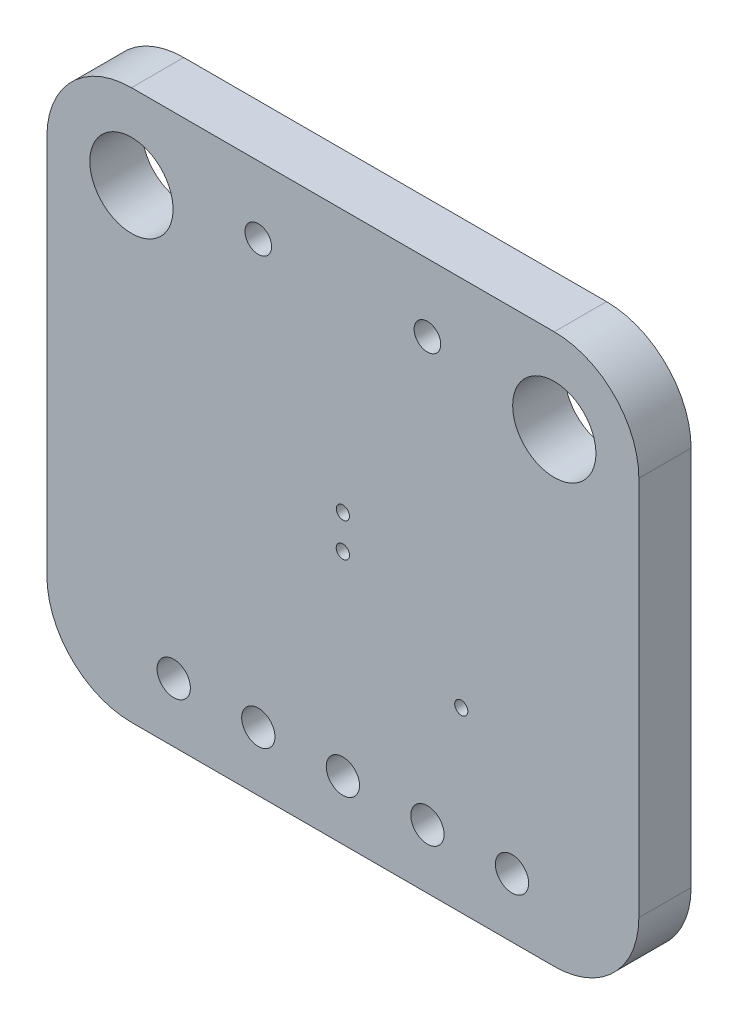
ISO-10303-21;
HEADER;
FILE_DESCRIPTION(('STEP AP214'),'2;1');
FILE_NAME('part.step','',(''),(''),'','','');
FILE_SCHEMA(('AUTOMOTIVE_DESIGN { 1 0 10303 214 1 1 1 1 }'));
ENDSEC;
DATA;
#1=APPLICATION_CONTEXT('core data for automotive mechanical design processes');
#2=APPLICATION_PROTOCOL_DEFINITION('international standard','automotive_design',2000,#1);
#3=PRODUCT_CONTEXT('',#1,'mechanical');
#4=PRODUCT('Part','Part','',(#3));
#5=PRODUCT_RELATED_PRODUCT_CATEGORY('part','',(#4));
#6=PRODUCT_DEFINITION_FORMATION('','',#4);
#7=PRODUCT_DEFINITION_CONTEXT('part definition',#1,'design');
#8=PRODUCT_DEFINITION('design','',#6,#7);
#9=PRODUCT_DEFINITION_SHAPE('','',#8);
#10=(LENGTH_UNIT() NAMED_UNIT(*) SI_UNIT(.MILLI.,.METRE.));
#11=(NAMED_UNIT(*) PLANE_ANGLE_UNIT() SI_UNIT($,.RADIAN.));
#12=(NAMED_UNIT(*) SI_UNIT($,.STERADIAN.) SOLID_ANGLE_UNIT());
#13=UNCERTAINTY_MEASURE_WITH_UNIT(LENGTH_MEASURE(1.E-05),#10,'distance_accuracy_value','');
#14=(GEOMETRIC_REPRESENTATION_CONTEXT(3) GLOBAL_UNCERTAINTY_ASSIGNED_CONTEXT((#13)) GLOBAL_UNIT_ASSIGNED_CONTEXT((#10,
#11,#12)) REPRESENTATION_CONTEXT('',''));
#15=CARTESIAN_POINT('',(0.,0.,0.));
#16=DIRECTION('',(0.,0.,1.));
#17=DIRECTION('',(1.,0.,0.));
#18=AXIS2_PLACEMENT_3D('',#15,#16,#17);
#19=CARTESIAN_POINT('',(8.89,8.255,0.));
#20=DIRECTION('',(0.,0.,1.));
#21=DIRECTION('',(1.,0.,0.));
#22=AXIS2_PLACEMENT_3D('',#19,#20,#21);
#23=PLANE('',#22);
#24=CARTESIAN_POINT('',(13.97,1.778,0.));
#25=DIRECTION('',(0.,0.,1.));
#26=DIRECTION('',(1.,0.,0.));
#27=AXIS2_PLACEMENT_3D('',#24,#25,#26);
#28=CIRCLE('',#27,0.5);
#29=CARTESIAN_POINT('',(13.47,1.778,0.));
#30=VERTEX_POINT('',#29);
#31=EDGE_CURVE('E308',#30,#30,#28,.T.);
#32=ORIENTED_EDGE('',*,*,#31,.T.);
#33=EDGE_LOOP('',(#32));
#34=FACE_BOUND('',#33,.T.);
#35=CARTESIAN_POINT('',(8.89,1.778,0.));
#36=DIRECTION('',(0.,0.,1.));
#37=DIRECTION('',(1.,0.,0.));
#38=AXIS2_PLACEMENT_3D('',#35,#36,#37);
#39=CIRCLE('',#38,0.5);
#40=CARTESIAN_POINT('',(8.39,1.778,0.));
#41=VERTEX_POINT('',#40);
#42=EDGE_CURVE('E262',#41,#41,#39,.T.);
#43=ORIENTED_EDGE('',*,*,#42,.T.);
#44=EDGE_LOOP('',(#43));
#45=FACE_BOUND('',#44,.T.);
#46=CARTESIAN_POINT('',(3.81,1.778,0.));
#47=DIRECTION('',(0.,0.,1.));
#48=DIRECTION('',(1.,0.,0.));
#49=AXIS2_PLACEMENT_3D('',#46,#47,#48);
#50=CIRCLE('',#49,0.5);
#51=CARTESIAN_POINT('',(3.31,1.778,0.));
#52=VERTEX_POINT('',#51);
#53=EDGE_CURVE('E346',#52,#52,#50,.T.);
#54=ORIENTED_EDGE('',*,*,#53,.T.);
#55=EDGE_LOOP('',(#54));
#56=FACE_BOUND('',#55,.T.);
#57=CARTESIAN_POINT('',(11.43,14.478,0.));
#58=DIRECTION('',(0.,0.,1.));
#59=DIRECTION('',(1.,0.,0.));
#60=AXIS2_PLACEMENT_3D('',#57,#58,#59);
#61=CIRCLE('',#60,0.4);
#62=CARTESIAN_POINT('',(11.03,14.478,0.));
#63=VERTEX_POINT('',#62);
#64=EDGE_CURVE('E298',#63,#63,#61,.T.);
#65=ORIENTED_EDGE('',*,*,#64,.T.);
#66=EDGE_LOOP('',(#65));
#67=FACE_BOUND('',#66,.T.);
#68=CARTESIAN_POINT('',(8.89,7.62,0.));
#69=DIRECTION('',(0.,0.,1.));
#70=DIRECTION('',(1.,0.,0.));
#71=AXIS2_PLACEMENT_3D('',#68,#69,#70);
#72=CIRCLE('',#71,0.2);
#73=CARTESIAN_POINT('',(8.69,7.62,0.));
#74=VERTEX_POINT('',#73);
#75=EDGE_CURVE('E316',#74,#74,#72,.T.);
#76=ORIENTED_EDGE('',*,*,#75,.T.);
#77=EDGE_LOOP('',(#76));
#78=FACE_BOUND('',#77,.T.);
#79=CARTESIAN_POINT('',(12.446,5.334,0.));
#80=DIRECTION('',(0.,0.,1.));
#81=DIRECTION('',(1.,0.,0.));
#82=AXIS2_PLACEMENT_3D('',#79,#80,#81);
#83=CIRCLE('',#82,0.197);
#84=CARTESIAN_POINT('',(12.249,5.334,0.));
#85=VERTEX_POINT('',#84);
#86=EDGE_CURVE('E290',#85,#85,#83,.T.);
#87=ORIENTED_EDGE('',*,*,#86,.T.);
#88=EDGE_LOOP('',(#87));
#89=FACE_BOUND('',#88,.T.);
#90=CARTESIAN_POINT('',(6.35,14.478,0.));
#91=DIRECTION('',(0.,0.,1.));
#92=DIRECTION('',(1.,0.,0.));
#93=AXIS2_PLACEMENT_3D('',#90,#91,#92);
#94=CIRCLE('',#93,0.4);
#95=CARTESIAN_POINT('',(5.95,14.478,0.));
#96=VERTEX_POINT('',#95);
#97=EDGE_CURVE('E279',#96,#96,#94,.T.);
#98=ORIENTED_EDGE('',*,*,#97,.T.);
#99=EDGE_LOOP('',(#98));
#100=FACE_BOUND('',#99,.T.);
#101=CARTESIAN_POINT('',(8.89,8.636,0.));
#102=DIRECTION('',(0.,0.,1.));
#103=DIRECTION('',(1.,0.,0.));
#104=AXIS2_PLACEMENT_3D('',#101,#102,#103);
#105=CIRCLE('',#104,0.197);
#106=CARTESIAN_POINT('',(8.693,8.636,0.));
#107=VERTEX_POINT('',#106);
#108=EDGE_CURVE('E268',#107,#107,#105,.T.);
#109=ORIENTED_EDGE('',*,*,#108,.T.);
#110=EDGE_LOOP('',(#109));
#111=FACE_BOUND('',#110,.T.);
#112=CARTESIAN_POINT('',(2.54,13.97,0.));
#113=DIRECTION('',(0.,0.,1.));
#114=DIRECTION('',(1.,0.,0.));
#115=AXIS2_PLACEMENT_3D('',#112,#113,#114);
#116=CIRCLE('',#115,1.25);
#117=CARTESIAN_POINT('',(1.29,13.97,0.));
#118=VERTEX_POINT('',#117);
#119=EDGE_CURVE('E256',#118,#118,#116,.T.);
#120=ORIENTED_EDGE('',*,*,#119,.T.);
#121=EDGE_LOOP('',(#120));
#122=FACE_BOUND('',#121,.T.);
#123=CARTESIAN_POINT('',(15.24,13.97,0.));
#124=DIRECTION('',(0.,0.,1.));
#125=DIRECTION('',(1.,0.,0.));
#126=AXIS2_PLACEMENT_3D('',#123,#124,#125);
#127=CIRCLE('',#126,1.25);
#128=CARTESIAN_POINT('',(13.99,13.97,0.));
#129=VERTEX_POINT('',#128);
#130=EDGE_CURVE('E231',#129,#129,#127,.T.);
#131=ORIENTED_EDGE('',*,*,#130,.T.);
#132=EDGE_LOOP('',(#131));
#133=FACE_BOUND('',#132,.T.);
#134=CARTESIAN_POINT('',(6.35,1.778,0.));
#135=DIRECTION('',(0.,0.,1.));
#136=DIRECTION('',(1.,0.,0.));
#137=AXIS2_PLACEMENT_3D('',#134,#135,#136);
#138=CIRCLE('',#137,0.5);
#139=CARTESIAN_POINT('',(5.85,1.778,0.));
#140=VERTEX_POINT('',#139);
#141=EDGE_CURVE('E222',#140,#140,#138,.T.);
#142=ORIENTED_EDGE('',*,*,#141,.T.);
#143=EDGE_LOOP('',(#142));
#144=FACE_BOUND('',#143,.T.);
#145=CARTESIAN_POINT('',(11.43,1.778,0.));
#146=DIRECTION('',(0.,0.,1.));
#147=DIRECTION('',(1.,0.,0.));
#148=AXIS2_PLACEMENT_3D('',#145,#146,#147);
#149=CIRCLE('',#148,0.5);
#150=CARTESIAN_POINT('',(10.93,1.778,0.));
#151=VERTEX_POINT('',#150);
#152=EDGE_CURVE('E201',#151,#151,#149,.T.);
#153=ORIENTED_EDGE('',*,*,#152,.T.);
#154=EDGE_LOOP('',(#153));
#155=FACE_BOUND('',#154,.T.);
#156=CARTESIAN_POINT('',(2.54,13.97,0.));
#157=DIRECTION('',(0.,0.,1.));
#158=DIRECTION('',(0.,1.,0.));
#159=AXIS2_PLACEMENT_3D('',#156,#157,#158);
#160=CIRCLE('',#159,2.54);
#161=CARTESIAN_POINT('',(2.54,16.51,0.));
#162=VERTEX_POINT('',#161);
#163=CARTESIAN_POINT('',(0.,13.97,0.));
#164=VERTEX_POINT('',#163);
#165=EDGE_CURVE('E25',#162,#164,#160,.T.);
#166=ORIENTED_EDGE('',*,*,#165,.F.);
#167=DIRECTION('',(1.,0.,0.));
#168=VECTOR('',#167,1.);
#169=CARTESIAN_POINT('',(2.54,16.51,0.));
#170=LINE('',#169,#168);
#171=CARTESIAN_POINT('',(15.24,16.51,0.));
#172=VERTEX_POINT('',#171);
#173=EDGE_CURVE('E367',#162,#172,#170,.T.);
#174=ORIENTED_EDGE('',*,*,#173,.T.);
#175=CARTESIAN_POINT('',(15.24,13.97,0.));
#176=DIRECTION('',(0.,0.,1.));
#177=DIRECTION('',(1.,0.,0.));
#178=AXIS2_PLACEMENT_3D('',#175,#176,#177);
#179=CIRCLE('',#178,2.54);
#180=CARTESIAN_POINT('',(17.78,13.97,0.));
#181=VERTEX_POINT('',#180);
#182=EDGE_CURVE('E335',#181,#172,#179,.T.);
#183=ORIENTED_EDGE('',*,*,#182,.F.);
#184=DIRECTION('',(0.,-1.,0.));
#185=VECTOR('',#184,1.);
#186=CARTESIAN_POINT('',(17.78,13.97,0.));
#187=LINE('',#186,#185);
#188=CARTESIAN_POINT('',(17.78,2.54,0.));
#189=VERTEX_POINT('',#188);
#190=EDGE_CURVE('E218',#181,#189,#187,.T.);
#191=ORIENTED_EDGE('',*,*,#190,.T.);
#192=CARTESIAN_POINT('',(15.24,2.54,0.));
#193=DIRECTION('',(0.,0.,1.));
#194=DIRECTION('',(0.,-1.,0.));
#195=AXIS2_PLACEMENT_3D('',#192,#193,#194);
#196=CIRCLE('',#195,2.54);
#197=CARTESIAN_POINT('',(15.24,0.,0.));
#198=VERTEX_POINT('',#197);
#199=EDGE_CURVE('E385',#198,#189,#196,.T.);
#200=ORIENTED_EDGE('',*,*,#199,.F.);
#201=DIRECTION('',(-1.,0.,0.));
#202=VECTOR('',#201,1.);
#203=CARTESIAN_POINT('',(15.24,0.,0.));
#204=LINE('',#203,#202);
#205=CARTESIAN_POINT('',(2.54,0.,0.));
#206=VERTEX_POINT('',#205);
#207=EDGE_CURVE('E317',#198,#206,#204,.T.);
#208=ORIENTED_EDGE('',*,*,#207,.T.);
#209=CARTESIAN_POINT('',(2.54,2.54,0.));
#210=DIRECTION('',(0.,0.,1.));
#211=DIRECTION('',(-1.,0.,0.));
#212=AXIS2_PLACEMENT_3D('',#209,#210,#211);
#213=CIRCLE('',#212,2.54);
#214=CARTESIAN_POINT('',(0.,2.54,0.));
#215=VERTEX_POINT('',#214);
#216=EDGE_CURVE('E248',#215,#206,#213,.T.);
#217=ORIENTED_EDGE('',*,*,#216,.F.);
#218=DIRECTION('',(0.,1.,0.));
#219=VECTOR('',#218,1.);
#220=CARTESIAN_POINT('',(0.,2.54,0.));
#221=LINE('',#220,#219);
#222=EDGE_CURVE('E405',#215,#164,#221,.T.);
#223=ORIENTED_EDGE('',*,*,#222,.T.);
#224=EDGE_LOOP('',(#166,#174,#183,#191,#200,#208,#217,#223));
#225=FACE_BOUND('',#224,.T.);
#226=ADVANCED_FACE('F17',(#34,#45,#56,#67,#78,#89,#100,#111,#122,#133,#144,#155,#225),#23,.F.);
#227=CARTESIAN_POINT('',(8.89,8.255,1.57));
#228=DIRECTION('',(0.,0.,1.));
#229=DIRECTION('',(1.,0.,0.));
#230=AXIS2_PLACEMENT_3D('',#227,#228,#229);
#231=PLANE('',#230);
#232=CARTESIAN_POINT('',(13.97,1.778,1.57));
#233=DIRECTION('',(0.,0.,-1.));
#234=DIRECTION('',(1.,0.,0.));
#235=AXIS2_PLACEMENT_3D('',#232,#233,#234);
#236=CIRCLE('',#235,0.5);
#237=CARTESIAN_POINT('',(13.47,1.778,1.57));
#238=VERTEX_POINT('',#237);
#239=EDGE_CURVE('E364',#238,#238,#236,.T.);
#240=ORIENTED_EDGE('',*,*,#239,.T.);
#241=EDGE_LOOP('',(#240));
#242=FACE_BOUND('',#241,.T.);
#243=CARTESIAN_POINT('',(8.89,1.778,1.57));
#244=DIRECTION('',(0.,0.,-1.));
#245=DIRECTION('',(1.,0.,0.));
#246=AXIS2_PLACEMENT_3D('',#243,#244,#245);
#247=CIRCLE('',#246,0.5);
#248=CARTESIAN_POINT('',(8.39,1.778,1.57));
#249=VERTEX_POINT('',#248);
#250=EDGE_CURVE('E313',#249,#249,#247,.T.);
#251=ORIENTED_EDGE('',*,*,#250,.T.);
#252=EDGE_LOOP('',(#251));
#253=FACE_BOUND('',#252,.T.);
#254=CARTESIAN_POINT('',(3.81,1.778,1.57));
#255=DIRECTION('',(0.,0.,-1.));
#256=DIRECTION('',(1.,0.,0.));
#257=AXIS2_PLACEMENT_3D('',#254,#255,#256);
#258=CIRCLE('',#257,0.5);
#259=CARTESIAN_POINT('',(3.31,1.778,1.57));
#260=VERTEX_POINT('',#259);
#261=EDGE_CURVE('E267',#260,#260,#258,.T.);
#262=ORIENTED_EDGE('',*,*,#261,.T.);
#263=EDGE_LOOP('',(#262));
#264=FACE_BOUND('',#263,.T.);
#265=CARTESIAN_POINT('',(11.43,14.478,1.57));
#266=DIRECTION('',(0.,0.,-1.));
#267=DIRECTION('',(1.,0.,0.));
#268=AXIS2_PLACEMENT_3D('',#265,#266,#267);
#269=CIRCLE('',#268,0.4);
#270=CARTESIAN_POINT('',(11.03,14.478,1.57));
#271=VERTEX_POINT('',#270);
#272=EDGE_CURVE('E343',#271,#271,#269,.T.);
#273=ORIENTED_EDGE('',*,*,#272,.T.);
#274=EDGE_LOOP('',(#273));
#275=FACE_BOUND('',#274,.T.);
#276=CARTESIAN_POINT('',(8.89,7.62,1.57));
#277=DIRECTION('',(0.,0.,-1.));
#278=DIRECTION('',(1.,0.,0.));
#279=AXIS2_PLACEMENT_3D('',#276,#277,#278);
#280=CIRCLE('',#279,0.2);
#281=CARTESIAN_POINT('',(8.69,7.62,1.57));
#282=VERTEX_POINT('',#281);
#283=EDGE_CURVE('E295',#282,#282,#280,.T.);
#284=ORIENTED_EDGE('',*,*,#283,.T.);
#285=EDGE_LOOP('',(#284));
#286=FACE_BOUND('',#285,.T.);
#287=CARTESIAN_POINT('',(12.446,5.334,1.57));
#288=DIRECTION('',(0.,0.,-1.));
#289=DIRECTION('',(1.,0.,0.));
#290=AXIS2_PLACEMENT_3D('',#287,#288,#289);
#291=CIRCLE('',#290,0.197);
#292=CARTESIAN_POINT('',(12.249,5.334,1.57));
#293=VERTEX_POINT('',#292);
#294=EDGE_CURVE('E303',#293,#293,#291,.T.);
#295=ORIENTED_EDGE('',*,*,#294,.T.);
#296=EDGE_LOOP('',(#295));
#297=FACE_BOUND('',#296,.T.);
#298=CARTESIAN_POINT('',(6.35,14.478,1.57));
#299=DIRECTION('',(0.,0.,-1.));
#300=DIRECTION('',(1.,0.,0.));
#301=AXIS2_PLACEMENT_3D('',#298,#299,#300);
#302=CIRCLE('',#301,0.4);
#303=CARTESIAN_POINT('',(5.95,14.478,1.57));
#304=VERTEX_POINT('',#303);
#305=EDGE_CURVE('E287',#304,#304,#302,.T.);
#306=ORIENTED_EDGE('',*,*,#305,.T.);
#307=EDGE_LOOP('',(#306));
#308=FACE_BOUND('',#307,.T.);
#309=CARTESIAN_POINT('',(8.89,8.636,1.57));
#310=DIRECTION('',(0.,0.,-1.));
#311=DIRECTION('',(1.,0.,0.));
#312=AXIS2_PLACEMENT_3D('',#309,#310,#311);
#313=CIRCLE('',#312,0.197);
#314=CARTESIAN_POINT('',(8.693,8.636,1.57));
#315=VERTEX_POINT('',#314);
#316=EDGE_CURVE('E276',#315,#315,#313,.T.);
#317=ORIENTED_EDGE('',*,*,#316,.T.);
#318=EDGE_LOOP('',(#317));
#319=FACE_BOUND('',#318,.T.);
#320=CARTESIAN_POINT('',(2.54,13.97,1.57));
#321=DIRECTION('',(0.,0.,-1.));
#322=DIRECTION('',(1.,0.,0.));
#323=AXIS2_PLACEMENT_3D('',#320,#321,#322);
#324=CIRCLE('',#323,1.25);
#325=CARTESIAN_POINT('',(1.29,13.97,1.57));
#326=VERTEX_POINT('',#325);
#327=EDGE_CURVE('E212',#326,#326,#324,.T.);
#328=ORIENTED_EDGE('',*,*,#327,.T.);
#329=EDGE_LOOP('',(#328));
#330=FACE_BOUND('',#329,.T.);
#331=CARTESIAN_POINT('',(15.24,13.97,1.57));
#332=DIRECTION('',(0.,0.,-1.));
#333=DIRECTION('',(1.,0.,0.));
#334=AXIS2_PLACEMENT_3D('',#331,#332,#333);
#335=CIRCLE('',#334,1.25);
#336=CARTESIAN_POINT('',(13.99,13.97,1.57));
#337=VERTEX_POINT('',#336);
#338=EDGE_CURVE('E243',#337,#337,#335,.T.);
#339=ORIENTED_EDGE('',*,*,#338,.T.);
#340=EDGE_LOOP('',(#339));
#341=FACE_BOUND('',#340,.T.);
#342=CARTESIAN_POINT('',(6.35,1.778,1.57));
#343=DIRECTION('',(0.,0.,-1.));
#344=DIRECTION('',(1.,0.,0.));
#345=AXIS2_PLACEMENT_3D('',#342,#343,#344);
#346=CIRCLE('',#345,0.5);
#347=CARTESIAN_POINT('',(5.85,1.778,1.57));
#348=VERTEX_POINT('',#347);
#349=EDGE_CURVE('E236',#348,#348,#346,.T.);
#350=ORIENTED_EDGE('',*,*,#349,.T.);
#351=EDGE_LOOP('',(#350));
#352=FACE_BOUND('',#351,.T.);
#353=CARTESIAN_POINT('',(11.43,1.778,1.57));
#354=DIRECTION('',(0.,0.,-1.));
#355=DIRECTION('',(1.,0.,0.));
#356=AXIS2_PLACEMENT_3D('',#353,#354,#355);
#357=CIRCLE('',#356,0.5);
#358=CARTESIAN_POINT('',(10.93,1.778,1.57));
#359=VERTEX_POINT('',#358);
#360=EDGE_CURVE('E202',#359,#359,#357,.T.);
#361=ORIENTED_EDGE('',*,*,#360,.T.);
#362=EDGE_LOOP('',(#361));
#363=FACE_BOUND('',#362,.T.);
#364=CARTESIAN_POINT('',(2.54,13.97,1.57));
#365=DIRECTION('',(0.,0.,1.));
#366=DIRECTION('',(0.,1.,0.));
#367=AXIS2_PLACEMENT_3D('',#364,#365,#366);
#368=CIRCLE('',#367,2.54);
#369=CARTESIAN_POINT('',(2.54,16.51,1.57));
#370=VERTEX_POINT('',#369);
#371=CARTESIAN_POINT('',(0.,13.97,1.57));
#372=VERTEX_POINT('',#371);
#373=EDGE_CURVE('E11',#370,#372,#368,.T.);
#374=ORIENTED_EDGE('',*,*,#373,.T.);
#375=DIRECTION('',(0.,-1.,0.));
#376=VECTOR('',#375,1.);
#377=CARTESIAN_POINT('',(0.,2.54,1.57));
#378=LINE('',#377,#376);
#379=CARTESIAN_POINT('',(0.,2.54,1.57));
#380=VERTEX_POINT('',#379);
#381=EDGE_CURVE('E307',#372,#380,#378,.T.);
#382=ORIENTED_EDGE('',*,*,#381,.T.);
#383=CARTESIAN_POINT('',(2.54,2.54,1.57));
#384=DIRECTION('',(0.,0.,1.));
#385=DIRECTION('',(-1.,0.,0.));
#386=AXIS2_PLACEMENT_3D('',#383,#384,#385);
#387=CIRCLE('',#386,2.54);
#388=CARTESIAN_POINT('',(2.54,0.,1.57));
#389=VERTEX_POINT('',#388);
#390=EDGE_CURVE('E398',#380,#389,#387,.T.);
#391=ORIENTED_EDGE('',*,*,#390,.T.);
#392=DIRECTION('',(1.,0.,0.));
#393=VECTOR('',#392,1.);
#394=CARTESIAN_POINT('',(15.24,0.,1.57));
#395=LINE('',#394,#393);
#396=CARTESIAN_POINT('',(15.24,0.,1.57));
#397=VERTEX_POINT('',#396);
#398=EDGE_CURVE('E249',#389,#397,#395,.T.);
#399=ORIENTED_EDGE('',*,*,#398,.T.);
#400=CARTESIAN_POINT('',(15.24,2.54,1.57));
#401=DIRECTION('',(0.,0.,1.));
#402=DIRECTION('',(0.,-1.,0.));
#403=AXIS2_PLACEMENT_3D('',#400,#401,#402);
#404=CIRCLE('',#403,2.54);
#405=CARTESIAN_POINT('',(17.78,2.54,1.57));
#406=VERTEX_POINT('',#405);
#407=EDGE_CURVE('E388',#397,#406,#404,.T.);
#408=ORIENTED_EDGE('',*,*,#407,.T.);
#409=DIRECTION('',(0.,1.,0.));
#410=VECTOR('',#409,1.);
#411=CARTESIAN_POINT('',(17.78,13.97,1.57));
#412=LINE('',#411,#410);
#413=CARTESIAN_POINT('',(17.78,13.97,1.57));
#414=VERTEX_POINT('',#413);
#415=EDGE_CURVE('E230',#406,#414,#412,.T.);
#416=ORIENTED_EDGE('',*,*,#415,.T.);
#417=CARTESIAN_POINT('',(15.24,13.97,1.57));
#418=DIRECTION('',(0.,0.,1.));
#419=DIRECTION('',(1.,0.,0.));
#420=AXIS2_PLACEMENT_3D('',#417,#418,#419);
#421=CIRCLE('',#420,2.54);
#422=CARTESIAN_POINT('',(15.24,16.51,1.57));
#423=VERTEX_POINT('',#422);
#424=EDGE_CURVE('E219',#414,#423,#421,.T.);
#425=ORIENTED_EDGE('',*,*,#424,.T.);
#426=DIRECTION('',(-1.,0.,0.));
#427=VECTOR('',#426,1.);
#428=CARTESIAN_POINT('',(2.54,16.51,1.57));
#429=LINE('',#428,#427);
#430=EDGE_CURVE('E325',#423,#370,#429,.T.);
#431=ORIENTED_EDGE('',*,*,#430,.T.);
#432=EDGE_LOOP('',(#374,#382,#391,#399,#408,#416,#425,#431));
#433=FACE_BOUND('',#432,.T.);
#434=ADVANCED_FACE('F580',(#242,#253,#264,#275,#286,#297,#308,#319,#330,#341,#352,#363,#433),
#231,.T.);
#435=CARTESIAN_POINT('',(2.54,13.97,0.));
#436=DIRECTION('',(0.,0.,1.));
#437=DIRECTION('',(0.,1.,0.));
#438=AXIS2_PLACEMENT_3D('',#435,#436,#437);
#439=CYLINDRICAL_SURFACE('',#438,2.54);
#440=ORIENTED_EDGE('',*,*,#165,.T.);
#441=DIRECTION('',(0.,0.,1.));
#442=VECTOR('',#441,1.);
#443=CARTESIAN_POINT('',(0.,13.97,0.));
#444=LINE('',#443,#442);
#445=EDGE_CURVE('E304',#164,#372,#444,.T.);
#446=ORIENTED_EDGE('',*,*,#445,.T.);
#447=ORIENTED_EDGE('',*,*,#373,.F.);
#448=DIRECTION('',(0.,0.,1.));
#449=VECTOR('',#448,1.);
#450=CARTESIAN_POINT('',(2.54,16.51,0.));
#451=LINE('',#450,#449);
#452=EDGE_CURVE('E329',#162,#370,#451,.T.);
#453=ORIENTED_EDGE('',*,*,#452,.F.);
#454=EDGE_LOOP('',(#440,#446,#447,#453));
#455=FACE_BOUND('',#454,.T.);
#456=ADVANCED_FACE('F571',(#455),#439,.T.);
#457=CARTESIAN_POINT('',(0.,13.97,0.));
#458=DIRECTION('',(-1.,0.,0.));
#459=DIRECTION('',(0.,0.,1.));
#460=AXIS2_PLACEMENT_3D('',#457,#458,#459);
#461=PLANE('',#460);
#462=ORIENTED_EDGE('',*,*,#222,.F.);
#463=DIRECTION('',(0.,0.,1.));
#464=VECTOR('',#463,1.);
#465=CARTESIAN_POINT('',(0.,2.54,0.));
#466=LINE('',#465,#464);
#467=EDGE_CURVE('E401',#215,#380,#466,.T.);
#468=ORIENTED_EDGE('',*,*,#467,.T.);
#469=ORIENTED_EDGE('',*,*,#381,.F.);
#470=ORIENTED_EDGE('',*,*,#445,.F.);
#471=EDGE_LOOP('',(#462,#468,#469,#470));
#472=FACE_BOUND('',#471,.T.);
#473=ADVANCED_FACE('F562',(#472),#461,.T.);
#474=CARTESIAN_POINT('',(2.54,2.54,0.));
#475=DIRECTION('',(0.,0.,1.));
#476=DIRECTION('',(-1.,0.,0.));
#477=AXIS2_PLACEMENT_3D('',#474,#475,#476);
#478=CYLINDRICAL_SURFACE('',#477,2.54);
#479=ORIENTED_EDGE('',*,*,#216,.T.);
#480=DIRECTION('',(0.,0.,1.));
#481=VECTOR('',#480,1.);
#482=CARTESIAN_POINT('',(2.54,0.,0.));
#483=LINE('',#482,#481);
#484=EDGE_CURVE('E244',#206,#389,#483,.T.);
#485=ORIENTED_EDGE('',*,*,#484,.T.);
#486=ORIENTED_EDGE('',*,*,#390,.F.);
#487=ORIENTED_EDGE('',*,*,#467,.F.);
#488=EDGE_LOOP('',(#479,#485,#486,#487));
#489=FACE_BOUND('',#488,.T.);
#490=ADVANCED_FACE('F553',(#489),#478,.T.);
#491=CARTESIAN_POINT('',(2.54,0.,0.));
#492=DIRECTION('',(0.,-1.,0.));
#493=DIRECTION('',(0.,0.,-1.));
#494=AXIS2_PLACEMENT_3D('',#491,#492,#493);
#495=PLANE('',#494);
#496=ORIENTED_EDGE('',*,*,#207,.F.);
#497=DIRECTION('',(0.,0.,1.));
#498=VECTOR('',#497,1.);
#499=CARTESIAN_POINT('',(15.24,0.,0.));
#500=LINE('',#499,#498);
#501=EDGE_CURVE('E321',#198,#397,#500,.T.);
#502=ORIENTED_EDGE('',*,*,#501,.T.);
#503=ORIENTED_EDGE('',*,*,#398,.F.);
#504=ORIENTED_EDGE('',*,*,#484,.F.);
#505=EDGE_LOOP('',(#496,#502,#503,#504));
#506=FACE_BOUND('',#505,.T.);
#507=ADVANCED_FACE('F529',(#506),#495,.T.);
#508=CARTESIAN_POINT('',(15.24,2.54,0.));
#509=DIRECTION('',(0.,0.,1.));
#510=DIRECTION('',(0.,-1.,0.));
#511=AXIS2_PLACEMENT_3D('',#508,#509,#510);
#512=CYLINDRICAL_SURFACE('',#511,2.54);
#513=ORIENTED_EDGE('',*,*,#199,.T.);
#514=DIRECTION('',(0.,0.,1.));
#515=VECTOR('',#514,1.);
#516=CARTESIAN_POINT('',(17.78,2.54,0.));
#517=LINE('',#516,#515);
#518=EDGE_CURVE('E381',#189,#406,#517,.T.);
#519=ORIENTED_EDGE('',*,*,#518,.T.);
#520=ORIENTED_EDGE('',*,*,#407,.F.);
#521=ORIENTED_EDGE('',*,*,#501,.F.);
#522=EDGE_LOOP('',(#513,#519,#520,#521));
#523=FACE_BOUND('',#522,.T.);
#524=ADVANCED_FACE('F439',(#523),#512,.T.);
#525=CARTESIAN_POINT('',(17.78,2.54,0.));
#526=DIRECTION('',(1.,0.,0.));
#527=DIRECTION('',(0.,1.,0.));
#528=AXIS2_PLACEMENT_3D('',#525,#526,#527);
#529=PLANE('',#528);
#530=ORIENTED_EDGE('',*,*,#190,.F.);
#531=DIRECTION('',(0.,0.,1.));
#532=VECTOR('',#531,1.);
#533=CARTESIAN_POINT('',(17.78,13.97,0.));
#534=LINE('',#533,#532);
#535=EDGE_CURVE('E214',#181,#414,#534,.T.);
#536=ORIENTED_EDGE('',*,*,#535,.T.);
#537=ORIENTED_EDGE('',*,*,#415,.F.);
#538=ORIENTED_EDGE('',*,*,#518,.F.);
#539=EDGE_LOOP('',(#530,#536,#537,#538));
#540=FACE_BOUND('',#539,.T.);
#541=ADVANCED_FACE('F434',(#540),#529,.T.);
#542=CARTESIAN_POINT('',(15.24,13.97,0.));
#543=DIRECTION('',(0.,0.,1.));
#544=DIRECTION('',(1.,0.,0.));
#545=AXIS2_PLACEMENT_3D('',#542,#543,#544);
#546=CYLINDRICAL_SURFACE('',#545,2.54);
#547=ORIENTED_EDGE('',*,*,#182,.T.);
#548=DIRECTION('',(0.,0.,1.));
#549=VECTOR('',#548,1.);
#550=CARTESIAN_POINT('',(15.24,16.51,0.));
#551=LINE('',#550,#549);
#552=EDGE_CURVE('E328',#172,#423,#551,.T.);
#553=ORIENTED_EDGE('',*,*,#552,.T.);
#554=ORIENTED_EDGE('',*,*,#424,.F.);
#555=ORIENTED_EDGE('',*,*,#535,.F.);
#556=EDGE_LOOP('',(#547,#553,#554,#555));
#557=FACE_BOUND('',#556,.T.);
#558=ADVANCED_FACE('F438',(#557),#546,.T.);
#559=CARTESIAN_POINT('',(15.24,16.51,0.));
#560=DIRECTION('',(0.,1.,0.));
#561=DIRECTION('',(1.,0.,0.));
#562=AXIS2_PLACEMENT_3D('',#559,#560,#561);
#563=PLANE('',#562);
#564=ORIENTED_EDGE('',*,*,#173,.F.);
#565=ORIENTED_EDGE('',*,*,#452,.T.);
#566=ORIENTED_EDGE('',*,*,#430,.F.);
#567=ORIENTED_EDGE('',*,*,#552,.F.);
#568=EDGE_LOOP('',(#564,#565,#566,#567));
#569=FACE_BOUND('',#568,.T.);
#570=ADVANCED_FACE('F454',(#569),#563,.T.);
#571=CARTESIAN_POINT('',(13.97,1.778,0.));
#572=DIRECTION('',(0.,0.,1.));
#573=DIRECTION('',(1.,0.,0.));
#574=AXIS2_PLACEMENT_3D('',#571,#572,#573);
#575=CYLINDRICAL_SURFACE('',#574,0.5);
#576=ORIENTED_EDGE('',*,*,#31,.F.);
#577=DIRECTION('',(0.,0.,1.));
#578=VECTOR('',#577,1.);
#579=CARTESIAN_POINT('',(13.47,1.778,0.));
#580=LINE('',#579,#578);
#581=EDGE_CURVE('E312',#30,#238,#580,.T.);
#582=ORIENTED_EDGE('',*,*,#581,.T.);
#583=ORIENTED_EDGE('',*,*,#239,.F.);
#584=ORIENTED_EDGE('',*,*,#581,.F.);
#585=EDGE_LOOP('',(#576,#582,#583,#584));
#586=FACE_BOUND('',#585,.T.);
#587=ADVANCED_FACE('F458',(#586),#575,.F.);
#588=CARTESIAN_POINT('',(8.89,1.778,0.));
#589=DIRECTION('',(0.,0.,1.));
#590=DIRECTION('',(1.,0.,0.));
#591=AXIS2_PLACEMENT_3D('',#588,#589,#590);
#592=CYLINDRICAL_SURFACE('',#591,0.5);
#593=ORIENTED_EDGE('',*,*,#42,.F.);
#594=DIRECTION('',(0.,0.,1.));
#595=VECTOR('',#594,1.);
#596=CARTESIAN_POINT('',(8.39,1.778,0.));
#597=LINE('',#596,#595);
#598=EDGE_CURVE('E266',#41,#249,#597,.T.);
#599=ORIENTED_EDGE('',*,*,#598,.T.);
#600=ORIENTED_EDGE('',*,*,#250,.F.);
#601=ORIENTED_EDGE('',*,*,#598,.F.);
#602=EDGE_LOOP('',(#593,#599,#600,#601));
#603=FACE_BOUND('',#602,.T.);
#604=ADVANCED_FACE('F474',(#603),#592,.F.);
#605=CARTESIAN_POINT('',(3.81,1.778,0.));
#606=DIRECTION('',(0.,0.,1.));
#607=DIRECTION('',(1.,0.,0.));
#608=AXIS2_PLACEMENT_3D('',#605,#606,#607);
#609=CYLINDRICAL_SURFACE('',#608,0.5);
#610=ORIENTED_EDGE('',*,*,#53,.F.);
#611=DIRECTION('',(0.,0.,1.));
#612=VECTOR('',#611,1.);
#613=CARTESIAN_POINT('',(3.31,1.778,0.));
#614=LINE('',#613,#612);
#615=EDGE_CURVE('E350',#52,#260,#614,.T.);
#616=ORIENTED_EDGE('',*,*,#615,.T.);
#617=ORIENTED_EDGE('',*,*,#261,.F.);
#618=ORIENTED_EDGE('',*,*,#615,.F.);
#619=EDGE_LOOP('',(#610,#616,#617,#618));
#620=FACE_BOUND('',#619,.T.);
#621=ADVANCED_FACE('F514',(#620),#609,.F.);
#622=CARTESIAN_POINT('',(11.43,14.478,0.));
#623=DIRECTION('',(0.,0.,1.));
#624=DIRECTION('',(1.,0.,0.));
#625=AXIS2_PLACEMENT_3D('',#622,#623,#624);
#626=CYLINDRICAL_SURFACE('',#625,0.4);
#627=ORIENTED_EDGE('',*,*,#64,.F.);
#628=DIRECTION('',(0.,0.,1.));
#629=VECTOR('',#628,1.);
#630=CARTESIAN_POINT('',(11.03,14.478,0.));
#631=LINE('',#630,#629);
#632=EDGE_CURVE('E339',#63,#271,#631,.T.);
#633=ORIENTED_EDGE('',*,*,#632,.T.);
#634=ORIENTED_EDGE('',*,*,#272,.F.);
#635=ORIENTED_EDGE('',*,*,#632,.F.);
#636=EDGE_LOOP('',(#627,#633,#634,#635));
#637=FACE_BOUND('',#636,.T.);
#638=ADVANCED_FACE('F506',(#637),#626,.F.);
#639=CARTESIAN_POINT('',(8.89,7.62,0.));
#640=DIRECTION('',(0.,0.,1.));
#641=DIRECTION('',(1.,0.,0.));
#642=AXIS2_PLACEMENT_3D('',#639,#640,#641);
#643=CYLINDRICAL_SURFACE('',#642,0.2);
#644=ORIENTED_EDGE('',*,*,#75,.F.);
#645=DIRECTION('',(0.,0.,1.));
#646=VECTOR('',#645,1.);
#647=CARTESIAN_POINT('',(8.69,7.62,0.));
#648=LINE('',#647,#646);
#649=EDGE_CURVE('E299',#74,#282,#648,.T.);
#650=ORIENTED_EDGE('',*,*,#649,.T.);
#651=ORIENTED_EDGE('',*,*,#283,.F.);
#652=ORIENTED_EDGE('',*,*,#649,.F.);
#653=EDGE_LOOP('',(#644,#650,#651,#652));
#654=FACE_BOUND('',#653,.T.);
#655=ADVANCED_FACE('F491',(#654),#643,.F.);
#656=CARTESIAN_POINT('',(12.446,5.334,0.));
#657=DIRECTION('',(0.,0.,1.));
#658=DIRECTION('',(1.,0.,0.));
#659=AXIS2_PLACEMENT_3D('',#656,#657,#658);
#660=CYLINDRICAL_SURFACE('',#659,0.197);
#661=ORIENTED_EDGE('',*,*,#86,.F.);
#662=DIRECTION('',(0.,0.,1.));
#663=VECTOR('',#662,1.);
#664=CARTESIAN_POINT('',(12.249,5.334,0.));
#665=LINE('',#664,#663);
#666=EDGE_CURVE('E294',#85,#293,#665,.T.);
#667=ORIENTED_EDGE('',*,*,#666,.T.);
#668=ORIENTED_EDGE('',*,*,#294,.F.);
#669=ORIENTED_EDGE('',*,*,#666,.F.);
#670=EDGE_LOOP('',(#661,#667,#668,#669));
#671=FACE_BOUND('',#670,.T.);
#672=ADVANCED_FACE('F487',(#671),#660,.F.);
#673=CARTESIAN_POINT('',(6.35,14.478,0.));
#674=DIRECTION('',(0.,0.,1.));
#675=DIRECTION('',(1.,0.,0.));
#676=AXIS2_PLACEMENT_3D('',#673,#674,#675);
#677=CYLINDRICAL_SURFACE('',#676,0.4);
#678=ORIENTED_EDGE('',*,*,#97,.F.);
#679=DIRECTION('',(0.,0.,1.));
#680=VECTOR('',#679,1.);
#681=CARTESIAN_POINT('',(5.95,14.478,0.));
#682=LINE('',#681,#680);
#683=EDGE_CURVE('E283',#96,#304,#682,.T.);
#684=ORIENTED_EDGE('',*,*,#683,.T.);
#685=ORIENTED_EDGE('',*,*,#305,.F.);
#686=ORIENTED_EDGE('',*,*,#683,.F.);
#687=EDGE_LOOP('',(#678,#684,#685,#686));
#688=FACE_BOUND('',#687,.T.);
#689=ADVANCED_FACE('F482',(#688),#677,.F.);
#690=CARTESIAN_POINT('',(8.89,8.636,0.));
#691=DIRECTION('',(0.,0.,1.));
#692=DIRECTION('',(1.,0.,0.));
#693=AXIS2_PLACEMENT_3D('',#690,#691,#692);
#694=CYLINDRICAL_SURFACE('',#693,0.197);
#695=ORIENTED_EDGE('',*,*,#108,.F.);
#696=DIRECTION('',(0.,0.,1.));
#697=VECTOR('',#696,1.);
#698=CARTESIAN_POINT('',(8.693,8.636,0.));
#699=LINE('',#698,#697);
#700=EDGE_CURVE('E272',#107,#315,#699,.T.);
#701=ORIENTED_EDGE('',*,*,#700,.T.);
#702=ORIENTED_EDGE('',*,*,#316,.F.);
#703=ORIENTED_EDGE('',*,*,#700,.F.);
#704=EDGE_LOOP('',(#695,#701,#702,#703));
#705=FACE_BOUND('',#704,.T.);
#706=ADVANCED_FACE('F449',(#705),#694,.F.);
#707=CARTESIAN_POINT('',(2.54,13.97,0.));
#708=DIRECTION('',(0.,0.,1.));
#709=DIRECTION('',(1.,0.,0.));
#710=AXIS2_PLACEMENT_3D('',#707,#708,#709);
#711=CYLINDRICAL_SURFACE('',#710,1.25);
#712=ORIENTED_EDGE('',*,*,#119,.F.);
#713=DIRECTION('',(0.,0.,1.));
#714=VECTOR('',#713,1.);
#715=CARTESIAN_POINT('',(1.29,13.97,0.));
#716=LINE('',#715,#714);
#717=EDGE_CURVE('E252',#118,#326,#716,.T.);
#718=ORIENTED_EDGE('',*,*,#717,.T.);
#719=ORIENTED_EDGE('',*,*,#327,.F.);
#720=ORIENTED_EDGE('',*,*,#717,.F.);
#721=EDGE_LOOP('',(#712,#718,#719,#720));
#722=FACE_BOUND('',#721,.T.);
#723=ADVANCED_FACE('F445',(#722),#711,.F.);
#724=CARTESIAN_POINT('',(15.24,13.97,0.));
#725=DIRECTION('',(0.,0.,1.));
#726=DIRECTION('',(1.,0.,0.));
#727=AXIS2_PLACEMENT_3D('',#724,#725,#726);
#728=CYLINDRICAL_SURFACE('',#727,1.25);
#729=ORIENTED_EDGE('',*,*,#130,.F.);
#730=DIRECTION('',(0.,0.,1.));
#731=VECTOR('',#730,1.);
#732=CARTESIAN_POINT('',(13.99,13.97,0.));
#733=LINE('',#732,#731);
#734=EDGE_CURVE('E235',#129,#337,#733,.T.);
#735=ORIENTED_EDGE('',*,*,#734,.T.);
#736=ORIENTED_EDGE('',*,*,#338,.F.);
#737=ORIENTED_EDGE('',*,*,#734,.F.);
#738=EDGE_LOOP('',(#729,#735,#736,#737));
#739=FACE_BOUND('',#738,.T.);
#740=ADVANCED_FACE('F422',(#739),#728,.F.);
#741=CARTESIAN_POINT('',(6.35,1.778,0.));
#742=DIRECTION('',(0.,0.,1.));
#743=DIRECTION('',(1.,0.,0.));
#744=AXIS2_PLACEMENT_3D('',#741,#742,#743);
#745=CYLINDRICAL_SURFACE('',#744,0.5);
#746=ORIENTED_EDGE('',*,*,#141,.F.);
#747=DIRECTION('',(0.,0.,1.));
#748=VECTOR('',#747,1.);
#749=CARTESIAN_POINT('',(5.85,1.778,0.));
#750=LINE('',#749,#748);
#751=EDGE_CURVE('E226',#140,#348,#750,.T.);
#752=ORIENTED_EDGE('',*,*,#751,.T.);
#753=ORIENTED_EDGE('',*,*,#349,.F.);
#754=ORIENTED_EDGE('',*,*,#751,.F.);
#755=EDGE_LOOP('',(#746,#752,#753,#754));
#756=FACE_BOUND('',#755,.T.);
#757=ADVANCED_FACE('F417',(#756),#745,.F.);
#758=CARTESIAN_POINT('',(11.43,1.778,0.));
#759=DIRECTION('',(0.,0.,1.));
#760=DIRECTION('',(1.,0.,0.));
#761=AXIS2_PLACEMENT_3D('',#758,#759,#760);
#762=CYLINDRICAL_SURFACE('',#761,0.5);
#763=ORIENTED_EDGE('',*,*,#152,.F.);
#764=DIRECTION('',(0.,0.,1.));
#765=VECTOR('',#764,1.);
#766=CARTESIAN_POINT('',(10.93,1.778,0.));
#767=LINE('',#766,#765);
#768=EDGE_CURVE('E198',#151,#359,#767,.T.);
#769=ORIENTED_EDGE('',*,*,#768,.T.);
#770=ORIENTED_EDGE('',*,*,#360,.F.);
#771=ORIENTED_EDGE('',*,*,#768,.F.);
#772=EDGE_LOOP('',(#763,#769,#770,#771));
#773=FACE_BOUND('',#772,.T.);
#774=ADVANCED_FACE('F200',(#773),#762,.F.);
#775=CLOSED_SHELL('',(#226,#434,#456,#473,#490,#507,#524,#541,#558,#570,#587,#604,#621,#638,
#655,#672,#689,#706,#723,#740,#757,#774));
#776=MANIFOLD_SOLID_BREP('B1',#775);
#777=ADVANCED_BREP_SHAPE_REPRESENTATION('',(#18,#776),#14);
#778=SHAPE_DEFINITION_REPRESENTATION(#9,#777);
ENDSEC;
END-ISO-10303-21;
